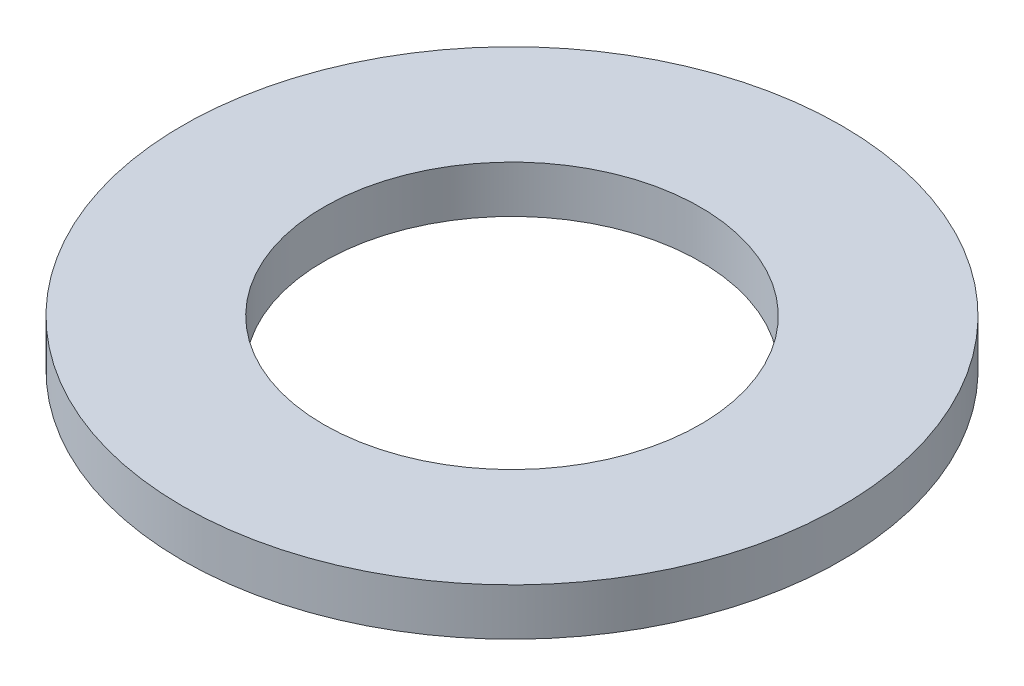
ISO-10303-21;
HEADER;
FILE_DESCRIPTION(('STEP AP214'),'2;1');
FILE_NAME('part.step','',(''),(''),'','','');
FILE_SCHEMA(('AUTOMOTIVE_DESIGN { 1 0 10303 214 1 1 1 1 }'));
ENDSEC;
DATA;
#1=APPLICATION_CONTEXT('core data for automotive mechanical design processes');
#2=APPLICATION_PROTOCOL_DEFINITION('international standard','automotive_design',2000,#1);
#3=PRODUCT_CONTEXT('',#1,'mechanical');
#4=PRODUCT('Part','Part','',(#3));
#5=PRODUCT_RELATED_PRODUCT_CATEGORY('part','',(#4));
#6=PRODUCT_DEFINITION_FORMATION('','',#4);
#7=PRODUCT_DEFINITION_CONTEXT('part definition',#1,'design');
#8=PRODUCT_DEFINITION('design','',#6,#7);
#9=PRODUCT_DEFINITION_SHAPE('','',#8);
#10=(LENGTH_UNIT() NAMED_UNIT(*) SI_UNIT(.MILLI.,.METRE.));
#11=(NAMED_UNIT(*) PLANE_ANGLE_UNIT() SI_UNIT($,.RADIAN.));
#12=(NAMED_UNIT(*) SI_UNIT($,.STERADIAN.) SOLID_ANGLE_UNIT());
#13=UNCERTAINTY_MEASURE_WITH_UNIT(LENGTH_MEASURE(1.E-05),#10,'distance_accuracy_value','');
#14=(GEOMETRIC_REPRESENTATION_CONTEXT(3) GLOBAL_UNCERTAINTY_ASSIGNED_CONTEXT((#13)) GLOBAL_UNIT_ASSIGNED_CONTEXT((#10,
#11,#12)) REPRESENTATION_CONTEXT('',''));
#15=CARTESIAN_POINT('',(0.,0.,0.));
#16=DIRECTION('',(0.,0.,1.));
#17=DIRECTION('',(1.,0.,0.));
#18=AXIS2_PLACEMENT_3D('',#15,#16,#17);
#19=CARTESIAN_POINT('',(0.,0.79375,0.));
#20=DIRECTION('',(0.,1.,0.));
#21=DIRECTION('',(0.,0.,1.));
#22=AXIS2_PLACEMENT_3D('',#19,#20,#21);
#23=PLANE('',#22);
#24=CARTESIAN_POINT('',(0.,0.79375,0.));
#25=DIRECTION('',(0.,1.,0.));
#26=DIRECTION('',(0.,0.,1.));
#27=AXIS2_PLACEMENT_3D('',#24,#25,#26);
#28=CIRCLE('',#27,11.1125);
#29=CARTESIAN_POINT('',(0.,0.79375,11.1125));
#30=VERTEX_POINT('',#29);
#31=EDGE_CURVE('E10',#30,#30,#28,.T.);
#32=ORIENTED_EDGE('',*,*,#31,.T.);
#33=EDGE_LOOP('',(#32));
#34=FACE_BOUND('',#33,.T.);
#35=CARTESIAN_POINT('',(0.,0.79375,0.));
#36=DIRECTION('',(0.,1.,0.));
#37=DIRECTION('',(0.,0.,1.));
#38=AXIS2_PLACEMENT_3D('',#35,#36,#37);
#39=CIRCLE('',#38,6.35);
#40=CARTESIAN_POINT('',(0.,0.79375,6.35));
#41=VERTEX_POINT('',#40);
#42=EDGE_CURVE('E48',#41,#41,#39,.T.);
#43=ORIENTED_EDGE('',*,*,#42,.F.);
#44=EDGE_LOOP('',(#43));
#45=FACE_BOUND('',#44,.T.);
#46=ADVANCED_FACE('F37',(#34,#45),#23,.T.);
#47=CARTESIAN_POINT('',(0.,-0.79375,0.));
#48=DIRECTION('',(0.,1.,0.));
#49=DIRECTION('',(0.,0.,1.));
#50=AXIS2_PLACEMENT_3D('',#47,#48,#49);
#51=PLANE('',#50);
#52=CARTESIAN_POINT('',(0.,-0.79375,0.));
#53=DIRECTION('',(0.,1.,0.));
#54=DIRECTION('',(0.,0.,1.));
#55=AXIS2_PLACEMENT_3D('',#52,#53,#54);
#56=CIRCLE('',#55,11.1125);
#57=CARTESIAN_POINT('',(0.,-0.79375,11.1125));
#58=VERTEX_POINT('',#57);
#59=EDGE_CURVE('E41',#58,#58,#56,.T.);
#60=ORIENTED_EDGE('',*,*,#59,.F.);
#61=EDGE_LOOP('',(#60));
#62=FACE_BOUND('',#61,.T.);
#63=CARTESIAN_POINT('',(0.,-0.79375,0.));
#64=DIRECTION('',(0.,1.,0.));
#65=DIRECTION('',(0.,0.,1.));
#66=AXIS2_PLACEMENT_3D('',#63,#64,#65);
#67=CIRCLE('',#66,6.35);
#68=CARTESIAN_POINT('',(0.,-0.79375,6.35));
#69=VERTEX_POINT('',#68);
#70=EDGE_CURVE('E50',#69,#69,#67,.T.);
#71=ORIENTED_EDGE('',*,*,#70,.T.);
#72=EDGE_LOOP('',(#71));
#73=FACE_BOUND('',#72,.T.);
#74=ADVANCED_FACE('F60',(#62,#73),#51,.F.);
#75=CARTESIAN_POINT('',(0.,0.79375,0.));
#76=DIRECTION('',(0.,-1.,0.));
#77=DIRECTION('',(0.,0.,-1.));
#78=AXIS2_PLACEMENT_3D('',#75,#76,#77);
#79=CYLINDRICAL_SURFACE('',#78,11.1125);
#80=ORIENTED_EDGE('',*,*,#31,.F.);
#81=EDGE_LOOP('',(#80));
#82=FACE_BOUND('',#81,.T.);
#83=ORIENTED_EDGE('',*,*,#59,.T.);
#84=EDGE_LOOP('',(#83));
#85=FACE_BOUND('',#84,.T.);
#86=ADVANCED_FACE('F39',(#82,#85),#79,.T.);
#87=CARTESIAN_POINT('',(0.,0.79375,0.));
#88=DIRECTION('',(0.,-1.,0.));
#89=DIRECTION('',(0.,0.,-1.));
#90=AXIS2_PLACEMENT_3D('',#87,#88,#89);
#91=CYLINDRICAL_SURFACE('',#90,6.35);
#92=ORIENTED_EDGE('',*,*,#42,.T.);
#93=EDGE_LOOP('',(#92));
#94=FACE_BOUND('',#93,.T.);
#95=ORIENTED_EDGE('',*,*,#70,.F.);
#96=EDGE_LOOP('',(#95));
#97=FACE_BOUND('',#96,.T.);
#98=ADVANCED_FACE('F56',(#94,#97),#91,.F.);
#99=CLOSED_SHELL('',(#46,#74,#86,#98));
#100=MANIFOLD_SOLID_BREP('B2',#99);
#101=ADVANCED_BREP_SHAPE_REPRESENTATION('',(#18,#100),#14);
#102=SHAPE_DEFINITION_REPRESENTATION(#9,#101);
ENDSEC;
END-ISO-10303-21;
